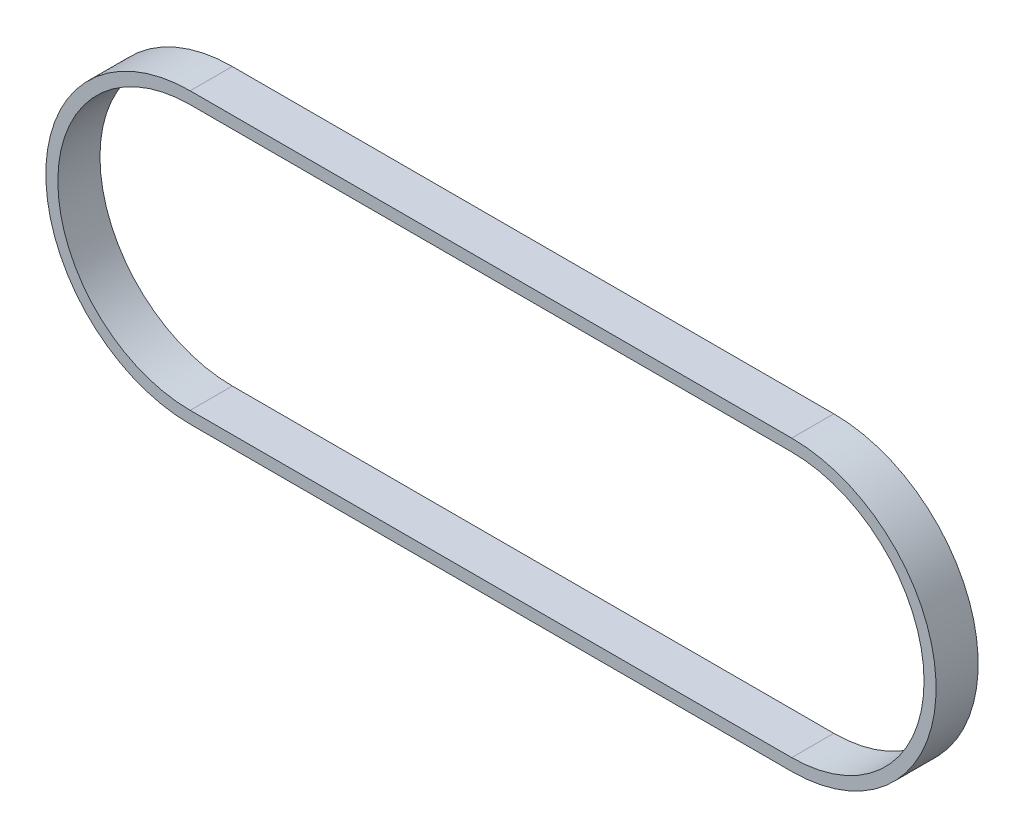
ISO-10303-21;
HEADER;
FILE_DESCRIPTION(('STEP AP214'),'2;1');
FILE_NAME('part.step','',(''),(''),'','','');
FILE_SCHEMA(('AUTOMOTIVE_DESIGN { 1 0 10303 214 1 1 1 1 }'));
ENDSEC;
DATA;
#1=APPLICATION_CONTEXT('core data for automotive mechanical design processes');
#2=APPLICATION_PROTOCOL_DEFINITION('international standard','automotive_design',2000,#1);
#3=PRODUCT_CONTEXT('',#1,'mechanical');
#4=PRODUCT('Part','Part','',(#3));
#5=PRODUCT_RELATED_PRODUCT_CATEGORY('part','',(#4));
#6=PRODUCT_DEFINITION_FORMATION('','',#4);
#7=PRODUCT_DEFINITION_CONTEXT('part definition',#1,'design');
#8=PRODUCT_DEFINITION('design','',#6,#7);
#9=PRODUCT_DEFINITION_SHAPE('','',#8);
#10=(LENGTH_UNIT() NAMED_UNIT(*) SI_UNIT(.MILLI.,.METRE.));
#11=(NAMED_UNIT(*) PLANE_ANGLE_UNIT() SI_UNIT($,.RADIAN.));
#12=(NAMED_UNIT(*) SI_UNIT($,.STERADIAN.) SOLID_ANGLE_UNIT());
#13=UNCERTAINTY_MEASURE_WITH_UNIT(LENGTH_MEASURE(1.E-05),#10,'distance_accuracy_value','');
#14=(GEOMETRIC_REPRESENTATION_CONTEXT(3) GLOBAL_UNCERTAINTY_ASSIGNED_CONTEXT((#13)) GLOBAL_UNIT_ASSIGNED_CONTEXT((#10,
#11,#12)) REPRESENTATION_CONTEXT('',''));
#15=CARTESIAN_POINT('',(0.,0.,0.));
#16=DIRECTION('',(0.,0.,1.));
#17=DIRECTION('',(1.,0.,0.));
#18=AXIS2_PLACEMENT_3D('',#15,#16,#17);
#19=CARTESIAN_POINT('',(0.,33.,10.5));
#20=DIRECTION('',(0.,1.,0.));
#21=DIRECTION('',(-1.,0.,0.));
#22=AXIS2_PLACEMENT_3D('',#19,#20,#21);
#23=PLANE('',#22);
#24=DIRECTION('',(1.,0.,0.));
#25=VECTOR('',#24,1.);
#26=CARTESIAN_POINT('',(0.,33.,0.));
#27=LINE('',#26,#25);
#28=CARTESIAN_POINT('',(0.,33.,0.));
#29=VERTEX_POINT('',#28);
#30=CARTESIAN_POINT('',(150.,33.,0.));
#31=VERTEX_POINT('',#30);
#32=EDGE_CURVE('E156',#29,#31,#27,.T.);
#33=ORIENTED_EDGE('',*,*,#32,.T.);
#34=DIRECTION('',(0.,0.,-1.));
#35=VECTOR('',#34,1.);
#36=CARTESIAN_POINT('',(150.,33.,10.5));
#37=LINE('',#36,#35);
#38=CARTESIAN_POINT('',(150.,33.,10.5));
#39=VERTEX_POINT('',#38);
#40=EDGE_CURVE('E11',#39,#31,#37,.T.);
#41=ORIENTED_EDGE('',*,*,#40,.F.);
#42=DIRECTION('',(1.,0.,0.));
#43=VECTOR('',#42,1.);
#44=CARTESIAN_POINT('',(0.,33.,10.5));
#45=LINE('',#44,#43);
#46=CARTESIAN_POINT('',(0.,33.,10.5));
#47=VERTEX_POINT('',#46);
#48=EDGE_CURVE('E128',#47,#39,#45,.T.);
#49=ORIENTED_EDGE('',*,*,#48,.F.);
#50=DIRECTION('',(0.,0.,-1.));
#51=VECTOR('',#50,1.);
#52=CARTESIAN_POINT('',(0.,33.,10.5));
#53=LINE('',#52,#51);
#54=EDGE_CURVE('E59',#47,#29,#53,.T.);
#55=ORIENTED_EDGE('',*,*,#54,.T.);
#56=EDGE_LOOP('',(#33,#41,#49,#55));
#57=FACE_BOUND('',#56,.T.);
#58=ADVANCED_FACE('F39',(#57),#23,.F.);
#59=CARTESIAN_POINT('',(150.,0.,10.5));
#60=DIRECTION('',(0.,0.,-1.));
#61=DIRECTION('',(-1.,0.,0.));
#62=AXIS2_PLACEMENT_3D('',#59,#60,#61);
#63=CYLINDRICAL_SURFACE('',#62,33.);
#64=CARTESIAN_POINT('',(150.,0.,0.));
#65=DIRECTION('',(0.,0.,1.));
#66=DIRECTION('',(1.,0.,0.));
#67=AXIS2_PLACEMENT_3D('',#64,#65,#66);
#68=CIRCLE('',#67,33.);
#69=CARTESIAN_POINT('',(150.,-33.,0.));
#70=VERTEX_POINT('',#69);
#71=EDGE_CURVE('E117',#70,#31,#68,.T.);
#72=ORIENTED_EDGE('',*,*,#71,.F.);
#73=DIRECTION('',(0.,0.,-1.));
#74=VECTOR('',#73,1.);
#75=CARTESIAN_POINT('',(150.,-33.,10.5));
#76=LINE('',#75,#74);
#77=CARTESIAN_POINT('',(150.,-33.,10.5));
#78=VERTEX_POINT('',#77);
#79=EDGE_CURVE('E50',#78,#70,#76,.T.);
#80=ORIENTED_EDGE('',*,*,#79,.F.);
#81=CARTESIAN_POINT('',(150.,0.,10.5));
#82=DIRECTION('',(0.,0.,1.));
#83=DIRECTION('',(1.,0.,0.));
#84=AXIS2_PLACEMENT_3D('',#81,#82,#83);
#85=CIRCLE('',#84,33.);
#86=EDGE_CURVE('E115',#78,#39,#85,.T.);
#87=ORIENTED_EDGE('',*,*,#86,.T.);
#88=ORIENTED_EDGE('',*,*,#40,.T.);
#89=EDGE_LOOP('',(#72,#80,#87,#88));
#90=FACE_BOUND('',#89,.T.);
#91=ADVANCED_FACE('F114',(#90),#63,.F.);
#92=CARTESIAN_POINT('',(0.,-33.,10.5));
#93=DIRECTION('',(0.,1.,0.));
#94=DIRECTION('',(-1.,0.,0.));
#95=AXIS2_PLACEMENT_3D('',#92,#93,#94);
#96=PLANE('',#95);
#97=DIRECTION('',(1.,0.,0.));
#98=VECTOR('',#97,1.);
#99=CARTESIAN_POINT('',(0.,-33.,0.));
#100=LINE('',#99,#98);
#101=CARTESIAN_POINT('',(0.,-33.,0.));
#102=VERTEX_POINT('',#101);
#103=EDGE_CURVE('E161',#102,#70,#100,.T.);
#104=ORIENTED_EDGE('',*,*,#103,.F.);
#105=DIRECTION('',(0.,0.,-1.));
#106=VECTOR('',#105,1.);
#107=CARTESIAN_POINT('',(0.,-33.,10.5));
#108=LINE('',#107,#106);
#109=CARTESIAN_POINT('',(0.,-33.,10.5));
#110=VERTEX_POINT('',#109);
#111=EDGE_CURVE('E84',#110,#102,#108,.T.);
#112=ORIENTED_EDGE('',*,*,#111,.F.);
#113=DIRECTION('',(1.,0.,0.));
#114=VECTOR('',#113,1.);
#115=CARTESIAN_POINT('',(0.,-33.,10.5));
#116=LINE('',#115,#114);
#117=EDGE_CURVE('E127',#110,#78,#116,.T.);
#118=ORIENTED_EDGE('',*,*,#117,.T.);
#119=ORIENTED_EDGE('',*,*,#79,.T.);
#120=EDGE_LOOP('',(#104,#112,#118,#119));
#121=FACE_BOUND('',#120,.T.);
#122=ADVANCED_FACE('F132',(#121),#96,.T.);
#123=CARTESIAN_POINT('',(0.,-36.,10.5));
#124=DIRECTION('',(0.,1.,0.));
#125=DIRECTION('',(-1.,0.,0.));
#126=AXIS2_PLACEMENT_3D('',#123,#124,#125);
#127=PLANE('',#126);
#128=DIRECTION('',(1.,0.,0.));
#129=VECTOR('',#128,1.);
#130=CARTESIAN_POINT('',(0.,-36.,0.));
#131=LINE('',#130,#129);
#132=CARTESIAN_POINT('',(0.,-36.,0.));
#133=VERTEX_POINT('',#132);
#134=CARTESIAN_POINT('',(150.,-36.,0.));
#135=VERTEX_POINT('',#134);
#136=EDGE_CURVE('E141',#133,#135,#131,.T.);
#137=ORIENTED_EDGE('',*,*,#136,.T.);
#138=DIRECTION('',(0.,0.,-1.));
#139=VECTOR('',#138,1.);
#140=CARTESIAN_POINT('',(150.,-36.,10.5));
#141=LINE('',#140,#139);
#142=CARTESIAN_POINT('',(150.,-36.,10.5));
#143=VERTEX_POINT('',#142);
#144=EDGE_CURVE('E43',#143,#135,#141,.T.);
#145=ORIENTED_EDGE('',*,*,#144,.F.);
#146=DIRECTION('',(1.,0.,0.));
#147=VECTOR('',#146,1.);
#148=CARTESIAN_POINT('',(0.,-36.,10.5));
#149=LINE('',#148,#147);
#150=CARTESIAN_POINT('',(0.,-36.,10.5));
#151=VERTEX_POINT('',#150);
#152=EDGE_CURVE('E168',#151,#143,#149,.T.);
#153=ORIENTED_EDGE('',*,*,#152,.F.);
#154=DIRECTION('',(0.,0.,-1.));
#155=VECTOR('',#154,1.);
#156=CARTESIAN_POINT('',(0.,-36.,10.5));
#157=LINE('',#156,#155);
#158=EDGE_CURVE('E137',#151,#133,#157,.T.);
#159=ORIENTED_EDGE('',*,*,#158,.T.);
#160=EDGE_LOOP('',(#137,#145,#153,#159));
#161=FACE_BOUND('',#160,.T.);
#162=ADVANCED_FACE('F41',(#161),#127,.F.);
#163=CARTESIAN_POINT('',(150.,0.,10.5));
#164=DIRECTION('',(0.,0.,-1.));
#165=DIRECTION('',(-1.,0.,0.));
#166=AXIS2_PLACEMENT_3D('',#163,#164,#165);
#167=CYLINDRICAL_SURFACE('',#166,36.);
#168=CARTESIAN_POINT('',(150.,0.,0.));
#169=DIRECTION('',(0.,0.,1.));
#170=DIRECTION('',(1.,0.,0.));
#171=AXIS2_PLACEMENT_3D('',#168,#169,#170);
#172=CIRCLE('',#171,36.);
#173=CARTESIAN_POINT('',(150.,36.,0.));
#174=VERTEX_POINT('',#173);
#175=EDGE_CURVE('E145',#135,#174,#172,.T.);
#176=ORIENTED_EDGE('',*,*,#175,.T.);
#177=DIRECTION('',(0.,0.,-1.));
#178=VECTOR('',#177,1.);
#179=CARTESIAN_POINT('',(150.,36.,10.5));
#180=LINE('',#179,#178);
#181=CARTESIAN_POINT('',(150.,36.,10.5));
#182=VERTEX_POINT('',#181);
#183=EDGE_CURVE('E178',#182,#174,#180,.T.);
#184=ORIENTED_EDGE('',*,*,#183,.F.);
#185=CARTESIAN_POINT('',(150.,0.,10.5));
#186=DIRECTION('',(0.,0.,1.));
#187=DIRECTION('',(1.,0.,0.));
#188=AXIS2_PLACEMENT_3D('',#185,#186,#187);
#189=CIRCLE('',#188,36.);
#190=EDGE_CURVE('E97',#143,#182,#189,.T.);
#191=ORIENTED_EDGE('',*,*,#190,.F.);
#192=ORIENTED_EDGE('',*,*,#144,.T.);
#193=EDGE_LOOP('',(#176,#184,#191,#192));
#194=FACE_BOUND('',#193,.T.);
#195=ADVANCED_FACE('F185',(#194),#167,.T.);
#196=CARTESIAN_POINT('',(0.,36.,10.5));
#197=DIRECTION('',(0.,1.,0.));
#198=DIRECTION('',(-1.,0.,0.));
#199=AXIS2_PLACEMENT_3D('',#196,#197,#198);
#200=PLANE('',#199);
#201=DIRECTION('',(1.,0.,0.));
#202=VECTOR('',#201,1.);
#203=CARTESIAN_POINT('',(0.,36.,0.));
#204=LINE('',#203,#202);
#205=CARTESIAN_POINT('',(0.,36.,0.));
#206=VERTEX_POINT('',#205);
#207=EDGE_CURVE('E149',#206,#174,#204,.T.);
#208=ORIENTED_EDGE('',*,*,#207,.F.);
#209=DIRECTION('',(0.,0.,-1.));
#210=VECTOR('',#209,1.);
#211=CARTESIAN_POINT('',(0.,36.,10.5));
#212=LINE('',#211,#210);
#213=CARTESIAN_POINT('',(0.,36.,10.5));
#214=VERTEX_POINT('',#213);
#215=EDGE_CURVE('E176',#214,#206,#212,.T.);
#216=ORIENTED_EDGE('',*,*,#215,.F.);
#217=DIRECTION('',(1.,0.,0.));
#218=VECTOR('',#217,1.);
#219=CARTESIAN_POINT('',(0.,36.,10.5));
#220=LINE('',#219,#218);
#221=EDGE_CURVE('E197',#214,#182,#220,.T.);
#222=ORIENTED_EDGE('',*,*,#221,.T.);
#223=ORIENTED_EDGE('',*,*,#183,.T.);
#224=EDGE_LOOP('',(#208,#216,#222,#223));
#225=FACE_BOUND('',#224,.T.);
#226=ADVANCED_FACE('F194',(#225),#200,.T.);
#227=CARTESIAN_POINT('',(0.,0.,10.5));
#228=DIRECTION('',(0.,0.,-1.));
#229=DIRECTION('',(-1.,0.,0.));
#230=AXIS2_PLACEMENT_3D('',#227,#228,#229);
#231=CYLINDRICAL_SURFACE('',#230,36.);
#232=CARTESIAN_POINT('',(0.,0.,0.));
#233=DIRECTION('',(0.,0.,1.));
#234=DIRECTION('',(1.,0.,0.));
#235=AXIS2_PLACEMENT_3D('',#232,#233,#234);
#236=CIRCLE('',#235,36.);
#237=EDGE_CURVE('E153',#206,#133,#236,.T.);
#238=ORIENTED_EDGE('',*,*,#237,.T.);
#239=ORIENTED_EDGE('',*,*,#158,.F.);
#240=CARTESIAN_POINT('',(0.,0.,10.5));
#241=DIRECTION('',(0.,0.,1.));
#242=DIRECTION('',(1.,0.,0.));
#243=AXIS2_PLACEMENT_3D('',#240,#241,#242);
#244=CIRCLE('',#243,36.);
#245=EDGE_CURVE('E199',#214,#151,#244,.T.);
#246=ORIENTED_EDGE('',*,*,#245,.F.);
#247=ORIENTED_EDGE('',*,*,#215,.T.);
#248=EDGE_LOOP('',(#238,#239,#246,#247));
#249=FACE_BOUND('',#248,.T.);
#250=ADVANCED_FACE('F200',(#249),#231,.T.);
#251=CARTESIAN_POINT('',(0.,0.,10.5));
#252=DIRECTION('',(0.,0.,-1.));
#253=DIRECTION('',(-1.,0.,0.));
#254=AXIS2_PLACEMENT_3D('',#251,#252,#253);
#255=CYLINDRICAL_SURFACE('',#254,33.);
#256=CARTESIAN_POINT('',(0.,0.,0.));
#257=DIRECTION('',(0.,0.,1.));
#258=DIRECTION('',(1.,0.,0.));
#259=AXIS2_PLACEMENT_3D('',#256,#257,#258);
#260=CIRCLE('',#259,33.);
#261=EDGE_CURVE('E164',#29,#102,#260,.T.);
#262=ORIENTED_EDGE('',*,*,#261,.F.);
#263=ORIENTED_EDGE('',*,*,#54,.F.);
#264=CARTESIAN_POINT('',(0.,0.,10.5));
#265=DIRECTION('',(0.,0.,1.));
#266=DIRECTION('',(1.,0.,0.));
#267=AXIS2_PLACEMENT_3D('',#264,#265,#266);
#268=CIRCLE('',#267,33.);
#269=EDGE_CURVE('E134',#47,#110,#268,.T.);
#270=ORIENTED_EDGE('',*,*,#269,.T.);
#271=ORIENTED_EDGE('',*,*,#111,.T.);
#272=EDGE_LOOP('',(#262,#263,#270,#271));
#273=FACE_BOUND('',#272,.T.);
#274=ADVANCED_FACE('F212',(#273),#255,.F.);
#275=CARTESIAN_POINT('',(0.,0.,10.5));
#276=DIRECTION('',(0.,0.,1.));
#277=DIRECTION('',(1.,0.,0.));
#278=AXIS2_PLACEMENT_3D('',#275,#276,#277);
#279=PLANE('',#278);
#280=ORIENTED_EDGE('',*,*,#152,.T.);
#281=ORIENTED_EDGE('',*,*,#190,.T.);
#282=ORIENTED_EDGE('',*,*,#221,.F.);
#283=ORIENTED_EDGE('',*,*,#245,.T.);
#284=EDGE_LOOP('',(#280,#281,#282,#283));
#285=FACE_BOUND('',#284,.T.);
#286=ORIENTED_EDGE('',*,*,#48,.T.);
#287=ORIENTED_EDGE('',*,*,#86,.F.);
#288=ORIENTED_EDGE('',*,*,#117,.F.);
#289=ORIENTED_EDGE('',*,*,#269,.F.);
#290=EDGE_LOOP('',(#286,#287,#288,#289));
#291=FACE_BOUND('',#290,.T.);
#292=ADVANCED_FACE('F125',(#285,#291),#279,.T.);
#293=CARTESIAN_POINT('',(0.,0.,0.));
#294=DIRECTION('',(0.,0.,1.));
#295=DIRECTION('',(1.,0.,0.));
#296=AXIS2_PLACEMENT_3D('',#293,#294,#295);
#297=PLANE('',#296);
#298=ORIENTED_EDGE('',*,*,#136,.F.);
#299=ORIENTED_EDGE('',*,*,#237,.F.);
#300=ORIENTED_EDGE('',*,*,#207,.T.);
#301=ORIENTED_EDGE('',*,*,#175,.F.);
#302=EDGE_LOOP('',(#298,#299,#300,#301));
#303=FACE_BOUND('',#302,.T.);
#304=ORIENTED_EDGE('',*,*,#32,.F.);
#305=ORIENTED_EDGE('',*,*,#261,.T.);
#306=ORIENTED_EDGE('',*,*,#103,.T.);
#307=ORIENTED_EDGE('',*,*,#71,.T.);
#308=EDGE_LOOP('',(#304,#305,#306,#307));
#309=FACE_BOUND('',#308,.T.);
#310=ADVANCED_FACE('F192',(#303,#309),#297,.F.);
#311=CLOSED_SHELL('',(#58,#91,#122,#162,#195,#226,#250,#274,#292,#310));
#312=MANIFOLD_SOLID_BREP('B2',#311);
#313=ADVANCED_BREP_SHAPE_REPRESENTATION('',(#18,#312),#14);
#314=SHAPE_DEFINITION_REPRESENTATION(#9,#313);
ENDSEC;
END-ISO-10303-21;
